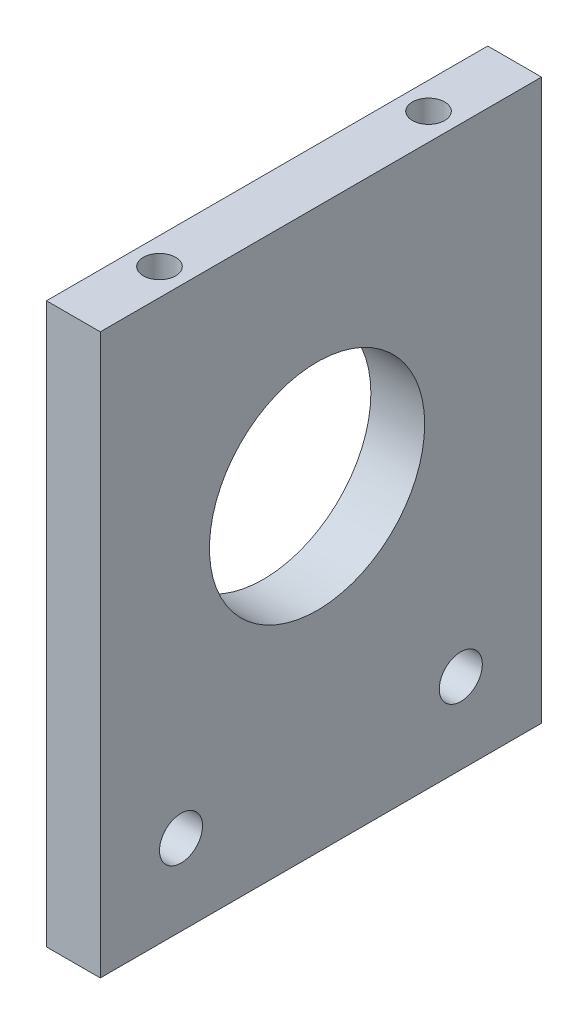
ISO-10303-21;
HEADER;
FILE_DESCRIPTION(('STEP AP214'),'2;1');
FILE_NAME('part.step','',(''),(''),'','','');
FILE_SCHEMA(('AUTOMOTIVE_DESIGN { 1 0 10303 214 1 1 1 1 }'));
ENDSEC;
DATA;
#1=APPLICATION_CONTEXT('core data for automotive mechanical design processes');
#2=APPLICATION_PROTOCOL_DEFINITION('international standard','automotive_design',2000,#1);
#3=PRODUCT_CONTEXT('',#1,'mechanical');
#4=PRODUCT('Part','Part','',(#3));
#5=PRODUCT_RELATED_PRODUCT_CATEGORY('part','',(#4));
#6=PRODUCT_DEFINITION_FORMATION('','',#4);
#7=PRODUCT_DEFINITION_CONTEXT('part definition',#1,'design');
#8=PRODUCT_DEFINITION('design','',#6,#7);
#9=PRODUCT_DEFINITION_SHAPE('','',#8);
#10=(LENGTH_UNIT() NAMED_UNIT(*) SI_UNIT(.MILLI.,.METRE.));
#11=(NAMED_UNIT(*) PLANE_ANGLE_UNIT() SI_UNIT($,.RADIAN.));
#12=(NAMED_UNIT(*) SI_UNIT($,.STERADIAN.) SOLID_ANGLE_UNIT());
#13=UNCERTAINTY_MEASURE_WITH_UNIT(LENGTH_MEASURE(1.E-05),#10,'distance_accuracy_value','');
#14=(GEOMETRIC_REPRESENTATION_CONTEXT(3) GLOBAL_UNCERTAINTY_ASSIGNED_CONTEXT((#13)) GLOBAL_UNIT_ASSIGNED_CONTEXT((#10,
#11,#12)) REPRESENTATION_CONTEXT('',''));
#15=CARTESIAN_POINT('',(0.,0.,0.));
#16=DIRECTION('',(0.,0.,1.));
#17=DIRECTION('',(1.,0.,0.));
#18=AXIS2_PLACEMENT_3D('',#15,#16,#17);
#19=CARTESIAN_POINT('',(5.,0.,0.));
#20=DIRECTION('',(-1.,0.,0.));
#21=DIRECTION('',(0.,0.,1.));
#22=AXIS2_PLACEMENT_3D('',#19,#20,#21);
#23=PLANE('',#22);
#24=CARTESIAN_POINT('',(5.,7.5,-33.5));
#25=DIRECTION('',(1.,0.,0.));
#26=DIRECTION('',(0.,0.,-1.));
#27=AXIS2_PLACEMENT_3D('',#24,#25,#26);
#28=CIRCLE('',#27,2.);
#29=CARTESIAN_POINT('',(5.,7.5,-35.5));
#30=VERTEX_POINT('',#29);
#31=EDGE_CURVE('E115',#30,#30,#28,.T.);
#32=ORIENTED_EDGE('',*,*,#31,.F.);
#33=EDGE_LOOP('',(#32));
#34=FACE_BOUND('',#33,.T.);
#35=DIRECTION('',(0.,-1.,0.));
#36=VECTOR('',#35,1.);
#37=CARTESIAN_POINT('',(5.,0.,0.));
#38=LINE('',#37,#36);
#39=CARTESIAN_POINT('',(5.,52.,0.));
#40=VERTEX_POINT('',#39);
#41=CARTESIAN_POINT('',(5.,0.,0.));
#42=VERTEX_POINT('',#41);
#43=EDGE_CURVE('E85',#40,#42,#38,.T.);
#44=ORIENTED_EDGE('',*,*,#43,.T.);
#45=DIRECTION('',(0.,0.,-1.));
#46=VECTOR('',#45,1.);
#47=CARTESIAN_POINT('',(5.,0.,0.));
#48=LINE('',#47,#46);
#49=CARTESIAN_POINT('',(5.,0.,-41.));
#50=VERTEX_POINT('',#49);
#51=EDGE_CURVE('E80',#42,#50,#48,.T.);
#52=ORIENTED_EDGE('',*,*,#51,.T.);
#53=DIRECTION('',(0.,1.,0.));
#54=VECTOR('',#53,1.);
#55=CARTESIAN_POINT('',(5.,0.,-41.));
#56=LINE('',#55,#54);
#57=CARTESIAN_POINT('',(5.,52.,-41.));
#58=VERTEX_POINT('',#57);
#59=EDGE_CURVE('E83',#50,#58,#56,.T.);
#60=ORIENTED_EDGE('',*,*,#59,.T.);
#61=DIRECTION('',(0.,0.,1.));
#62=VECTOR('',#61,1.);
#63=CARTESIAN_POINT('',(5.,52.,0.));
#64=LINE('',#63,#62);
#65=EDGE_CURVE('E50',#58,#40,#64,.T.);
#66=ORIENTED_EDGE('',*,*,#65,.T.);
#67=EDGE_LOOP('',(#44,#52,#60,#66));
#68=FACE_BOUND('',#67,.T.);
#69=CARTESIAN_POINT('',(5.,7.5,-7.5));
#70=DIRECTION('',(1.,0.,0.));
#71=DIRECTION('',(0.,0.,-1.));
#72=AXIS2_PLACEMENT_3D('',#69,#70,#71);
#73=CIRCLE('',#72,2.);
#74=CARTESIAN_POINT('',(5.,7.5,-9.5));
#75=VERTEX_POINT('',#74);
#76=EDGE_CURVE('E100',#75,#75,#73,.T.);
#77=ORIENTED_EDGE('',*,*,#76,.F.);
#78=EDGE_LOOP('',(#77));
#79=FACE_BOUND('',#78,.T.);
#80=CARTESIAN_POINT('',(5.,29.5,-20.1430247661483));
#81=DIRECTION('',(1.,0.,0.));
#82=DIRECTION('',(0.,0.,-1.));
#83=AXIS2_PLACEMENT_3D('',#80,#81,#82);
#84=CIRCLE('',#83,10.);
#85=CARTESIAN_POINT('',(5.,29.5,-30.1430247661483));
#86=VERTEX_POINT('',#85);
#87=EDGE_CURVE('E121',#86,#86,#84,.T.);
#88=ORIENTED_EDGE('',*,*,#87,.F.);
#89=EDGE_LOOP('',(#88));
#90=FACE_BOUND('',#89,.T.);
#91=ADVANCED_FACE('F33',(#34,#68,#79,#90),#23,.F.);
#92=CARTESIAN_POINT('',(0.,0.,0.));
#93=DIRECTION('',(-1.,0.,0.));
#94=DIRECTION('',(0.,0.,1.));
#95=AXIS2_PLACEMENT_3D('',#92,#93,#94);
#96=PLANE('',#95);
#97=CARTESIAN_POINT('',(0.,7.5,-33.5));
#98=DIRECTION('',(1.,0.,0.));
#99=DIRECTION('',(0.,0.,-1.));
#100=AXIS2_PLACEMENT_3D('',#97,#98,#99);
#101=CIRCLE('',#100,2.);
#102=CARTESIAN_POINT('',(0.,7.5,-35.5));
#103=VERTEX_POINT('',#102);
#104=EDGE_CURVE('E118',#103,#103,#101,.T.);
#105=ORIENTED_EDGE('',*,*,#104,.T.);
#106=EDGE_LOOP('',(#105));
#107=FACE_BOUND('',#106,.T.);
#108=DIRECTION('',(0.,-1.,0.));
#109=VECTOR('',#108,1.);
#110=CARTESIAN_POINT('',(0.,0.,0.));
#111=LINE('',#110,#109);
#112=CARTESIAN_POINT('',(0.,52.,0.));
#113=VERTEX_POINT('',#112);
#114=CARTESIAN_POINT('',(0.,0.,0.));
#115=VERTEX_POINT('',#114);
#116=EDGE_CURVE('E97',#113,#115,#111,.T.);
#117=ORIENTED_EDGE('',*,*,#116,.F.);
#118=DIRECTION('',(0.,0.,1.));
#119=VECTOR('',#118,1.);
#120=CARTESIAN_POINT('',(0.,52.,0.));
#121=LINE('',#120,#119);
#122=CARTESIAN_POINT('',(0.,52.,-41.));
#123=VERTEX_POINT('',#122);
#124=EDGE_CURVE('E73',#123,#113,#121,.T.);
#125=ORIENTED_EDGE('',*,*,#124,.F.);
#126=DIRECTION('',(0.,1.,0.));
#127=VECTOR('',#126,1.);
#128=CARTESIAN_POINT('',(0.,0.,-41.));
#129=LINE('',#128,#127);
#130=CARTESIAN_POINT('',(0.,0.,-41.));
#131=VERTEX_POINT('',#130);
#132=EDGE_CURVE('E67',#131,#123,#129,.T.);
#133=ORIENTED_EDGE('',*,*,#132,.F.);
#134=DIRECTION('',(0.,0.,-1.));
#135=VECTOR('',#134,1.);
#136=CARTESIAN_POINT('',(0.,0.,0.));
#137=LINE('',#136,#135);
#138=EDGE_CURVE('E89',#115,#131,#137,.T.);
#139=ORIENTED_EDGE('',*,*,#138,.F.);
#140=EDGE_LOOP('',(#117,#125,#133,#139));
#141=FACE_BOUND('',#140,.T.);
#142=CARTESIAN_POINT('',(0.,7.5,-7.5));
#143=DIRECTION('',(1.,0.,0.));
#144=DIRECTION('',(0.,0.,-1.));
#145=AXIS2_PLACEMENT_3D('',#142,#143,#144);
#146=CIRCLE('',#145,2.);
#147=CARTESIAN_POINT('',(0.,7.5,-9.5));
#148=VERTEX_POINT('',#147);
#149=EDGE_CURVE('E112',#148,#148,#146,.T.);
#150=ORIENTED_EDGE('',*,*,#149,.T.);
#151=EDGE_LOOP('',(#150));
#152=FACE_BOUND('',#151,.T.);
#153=CARTESIAN_POINT('',(0.,29.5,-20.1430247661483));
#154=DIRECTION('',(1.,0.,0.));
#155=DIRECTION('',(0.,0.,-1.));
#156=AXIS2_PLACEMENT_3D('',#153,#154,#155);
#157=CIRCLE('',#156,10.);
#158=CARTESIAN_POINT('',(0.,29.5,-30.1430247661483));
#159=VERTEX_POINT('',#158);
#160=EDGE_CURVE('E124',#159,#159,#157,.T.);
#161=ORIENTED_EDGE('',*,*,#160,.T.);
#162=EDGE_LOOP('',(#161));
#163=FACE_BOUND('',#162,.T.);
#164=ADVANCED_FACE('F108',(#107,#141,#152,#163),#96,.T.);
#165=CARTESIAN_POINT('',(5.,0.,0.));
#166=DIRECTION('',(0.,0.,-1.));
#167=DIRECTION('',(-1.,0.,0.));
#168=AXIS2_PLACEMENT_3D('',#165,#166,#167);
#169=PLANE('',#168);
#170=ORIENTED_EDGE('',*,*,#116,.T.);
#171=DIRECTION('',(-1.,0.,0.));
#172=VECTOR('',#171,1.);
#173=CARTESIAN_POINT('',(5.,0.,0.));
#174=LINE('',#173,#172);
#175=EDGE_CURVE('E11',#42,#115,#174,.T.);
#176=ORIENTED_EDGE('',*,*,#175,.F.);
#177=ORIENTED_EDGE('',*,*,#43,.F.);
#178=DIRECTION('',(-1.,0.,0.));
#179=VECTOR('',#178,1.);
#180=CARTESIAN_POINT('',(5.,52.,0.));
#181=LINE('',#180,#179);
#182=EDGE_CURVE('E93',#40,#113,#181,.T.);
#183=ORIENTED_EDGE('',*,*,#182,.T.);
#184=EDGE_LOOP('',(#170,#176,#177,#183));
#185=FACE_BOUND('',#184,.T.);
#186=ADVANCED_FACE('F35',(#185),#169,.F.);
#187=CARTESIAN_POINT('',(5.,0.,0.));
#188=DIRECTION('',(0.,1.,0.));
#189=DIRECTION('',(0.,0.,1.));
#190=AXIS2_PLACEMENT_3D('',#187,#188,#189);
#191=PLANE('',#190);
#192=CARTESIAN_POINT('',(2.5,0.,-28.));
#193=DIRECTION('',(0.,-1.,0.));
#194=DIRECTION('',(0.,0.,-1.));
#195=AXIS2_PLACEMENT_3D('',#192,#193,#194);
#196=CIRCLE('',#195,1.5);
#197=CARTESIAN_POINT('',(2.5,0.,-29.5));
#198=VERTEX_POINT('',#197);
#199=EDGE_CURVE('E136',#198,#198,#196,.T.);
#200=ORIENTED_EDGE('',*,*,#199,.F.);
#201=EDGE_LOOP('',(#200));
#202=FACE_BOUND('',#201,.T.);
#203=CARTESIAN_POINT('',(2.5,0.,-13.));
#204=DIRECTION('',(0.,-1.,0.));
#205=DIRECTION('',(0.,0.,-1.));
#206=AXIS2_PLACEMENT_3D('',#203,#204,#205);
#207=CIRCLE('',#206,1.5);
#208=CARTESIAN_POINT('',(2.5,0.,-14.5));
#209=VERTEX_POINT('',#208);
#210=EDGE_CURVE('E130',#209,#209,#207,.T.);
#211=ORIENTED_EDGE('',*,*,#210,.F.);
#212=EDGE_LOOP('',(#211));
#213=FACE_BOUND('',#212,.T.);
#214=ORIENTED_EDGE('',*,*,#138,.T.);
#215=DIRECTION('',(-1.,0.,0.));
#216=VECTOR('',#215,1.);
#217=CARTESIAN_POINT('',(5.,0.,-41.));
#218=LINE('',#217,#216);
#219=EDGE_CURVE('E42',#50,#131,#218,.T.);
#220=ORIENTED_EDGE('',*,*,#219,.F.);
#221=ORIENTED_EDGE('',*,*,#51,.F.);
#222=ORIENTED_EDGE('',*,*,#175,.T.);
#223=EDGE_LOOP('',(#214,#220,#221,#222));
#224=FACE_BOUND('',#223,.T.);
#225=ADVANCED_FACE('F88',(#202,#213,#224),#191,.F.);
#226=CARTESIAN_POINT('',(5.,0.,-41.));
#227=DIRECTION('',(0.,0.,1.));
#228=DIRECTION('',(1.,0.,0.));
#229=AXIS2_PLACEMENT_3D('',#226,#227,#228);
#230=PLANE('',#229);
#231=ORIENTED_EDGE('',*,*,#132,.T.);
#232=DIRECTION('',(-1.,0.,0.));
#233=VECTOR('',#232,1.);
#234=CARTESIAN_POINT('',(5.,52.,-41.));
#235=LINE('',#234,#233);
#236=EDGE_CURVE('E90',#58,#123,#235,.T.);
#237=ORIENTED_EDGE('',*,*,#236,.F.);
#238=ORIENTED_EDGE('',*,*,#59,.F.);
#239=ORIENTED_EDGE('',*,*,#219,.T.);
#240=EDGE_LOOP('',(#231,#237,#238,#239));
#241=FACE_BOUND('',#240,.T.);
#242=ADVANCED_FACE('F91',(#241),#230,.F.);
#243=CARTESIAN_POINT('',(5.,52.,0.));
#244=DIRECTION('',(0.,-1.,0.));
#245=DIRECTION('',(0.,0.,-1.));
#246=AXIS2_PLACEMENT_3D('',#243,#244,#245);
#247=PLANE('',#246);
#248=CARTESIAN_POINT('',(2.5,52.,-33.));
#249=DIRECTION('',(0.,1.,0.));
#250=DIRECTION('',(0.,0.,1.));
#251=AXIS2_PLACEMENT_3D('',#248,#249,#250);
#252=CIRCLE('',#251,1.5);
#253=CARTESIAN_POINT('',(2.5,52.,-31.5));
#254=VERTEX_POINT('',#253);
#255=EDGE_CURVE('E148',#254,#254,#252,.T.);
#256=ORIENTED_EDGE('',*,*,#255,.F.);
#257=EDGE_LOOP('',(#256));
#258=FACE_BOUND('',#257,.T.);
#259=CARTESIAN_POINT('',(2.5,52.,-8.));
#260=DIRECTION('',(0.,1.,0.));
#261=DIRECTION('',(0.,0.,1.));
#262=AXIS2_PLACEMENT_3D('',#259,#260,#261);
#263=CIRCLE('',#262,1.5);
#264=CARTESIAN_POINT('',(2.5,52.,-6.5));
#265=VERTEX_POINT('',#264);
#266=EDGE_CURVE('E142',#265,#265,#263,.T.);
#267=ORIENTED_EDGE('',*,*,#266,.F.);
#268=EDGE_LOOP('',(#267));
#269=FACE_BOUND('',#268,.T.);
#270=ORIENTED_EDGE('',*,*,#124,.T.);
#271=ORIENTED_EDGE('',*,*,#182,.F.);
#272=ORIENTED_EDGE('',*,*,#65,.F.);
#273=ORIENTED_EDGE('',*,*,#236,.T.);
#274=EDGE_LOOP('',(#270,#271,#272,#273));
#275=FACE_BOUND('',#274,.T.);
#276=ADVANCED_FACE('F105',(#258,#269,#275),#247,.F.);
#277=CARTESIAN_POINT('',(5.,7.5,-7.5));
#278=DIRECTION('',(-1.,0.,0.));
#279=DIRECTION('',(0.,0.,1.));
#280=AXIS2_PLACEMENT_3D('',#277,#278,#279);
#281=CYLINDRICAL_SURFACE('',#280,2.);
#282=ORIENTED_EDGE('',*,*,#76,.T.);
#283=EDGE_LOOP('',(#282));
#284=FACE_BOUND('',#283,.T.);
#285=ORIENTED_EDGE('',*,*,#149,.F.);
#286=EDGE_LOOP('',(#285));
#287=FACE_BOUND('',#286,.T.);
#288=ADVANCED_FACE('F165',(#284,#287),#281,.F.);
#289=CARTESIAN_POINT('',(5.,7.5,-33.5));
#290=DIRECTION('',(-1.,0.,0.));
#291=DIRECTION('',(0.,0.,1.));
#292=AXIS2_PLACEMENT_3D('',#289,#290,#291);
#293=CYLINDRICAL_SURFACE('',#292,2.);
#294=ORIENTED_EDGE('',*,*,#31,.T.);
#295=EDGE_LOOP('',(#294));
#296=FACE_BOUND('',#295,.T.);
#297=ORIENTED_EDGE('',*,*,#104,.F.);
#298=EDGE_LOOP('',(#297));
#299=FACE_BOUND('',#298,.T.);
#300=ADVANCED_FACE('F218',(#296,#299),#293,.F.);
#301=CARTESIAN_POINT('',(5.,29.5,-20.1430247661483));
#302=DIRECTION('',(-1.,0.,0.));
#303=DIRECTION('',(0.,0.,1.));
#304=AXIS2_PLACEMENT_3D('',#301,#302,#303);
#305=CYLINDRICAL_SURFACE('',#304,10.);
#306=ORIENTED_EDGE('',*,*,#87,.T.);
#307=EDGE_LOOP('',(#306));
#308=FACE_BOUND('',#307,.T.);
#309=ORIENTED_EDGE('',*,*,#160,.F.);
#310=EDGE_LOOP('',(#309));
#311=FACE_BOUND('',#310,.T.);
#312=ADVANCED_FACE('F209',(#308,#311),#305,.F.);
#313=CARTESIAN_POINT('',(2.5,7.,-13.));
#314=DIRECTION('',(0.,-1.,0.));
#315=DIRECTION('',(0.,0.,-1.));
#316=AXIS2_PLACEMENT_3D('',#313,#314,#315);
#317=CYLINDRICAL_SURFACE('',#316,1.5);
#318=CARTESIAN_POINT('',(2.5,7.,-13.));
#319=DIRECTION('',(0.,-1.,0.));
#320=DIRECTION('',(0.,0.,-1.));
#321=AXIS2_PLACEMENT_3D('',#318,#319,#320);
#322=CIRCLE('',#321,1.5);
#323=CARTESIAN_POINT('',(2.5,7.,-14.5));
#324=VERTEX_POINT('',#323);
#325=EDGE_CURVE('E127',#324,#324,#322,.T.);
#326=ORIENTED_EDGE('',*,*,#325,.F.);
#327=EDGE_LOOP('',(#326));
#328=FACE_BOUND('',#327,.T.);
#329=ORIENTED_EDGE('',*,*,#210,.T.);
#330=EDGE_LOOP('',(#329));
#331=FACE_BOUND('',#330,.T.);
#332=ADVANCED_FACE('F206',(#328,#331),#317,.F.);
#333=CARTESIAN_POINT('',(2.5,7.,-13.));
#334=DIRECTION('',(0.,-1.,0.));
#335=DIRECTION('',(0.,0.,-1.));
#336=AXIS2_PLACEMENT_3D('',#333,#334,#335);
#337=PLANE('',#336);
#338=ORIENTED_EDGE('',*,*,#325,.T.);
#339=EDGE_LOOP('',(#338));
#340=FACE_BOUND('',#339,.T.);
#341=ADVANCED_FACE('F208',(#340),#337,.T.);
#342=CARTESIAN_POINT('',(2.5,7.,-28.));
#343=DIRECTION('',(0.,-1.,0.));
#344=DIRECTION('',(0.,0.,-1.));
#345=AXIS2_PLACEMENT_3D('',#342,#343,#344);
#346=CYLINDRICAL_SURFACE('',#345,1.5);
#347=CARTESIAN_POINT('',(2.5,7.,-28.));
#348=DIRECTION('',(0.,-1.,0.));
#349=DIRECTION('',(0.,0.,-1.));
#350=AXIS2_PLACEMENT_3D('',#347,#348,#349);
#351=CIRCLE('',#350,1.5);
#352=CARTESIAN_POINT('',(2.5,7.,-29.5));
#353=VERTEX_POINT('',#352);
#354=EDGE_CURVE('E133',#353,#353,#351,.T.);
#355=ORIENTED_EDGE('',*,*,#354,.F.);
#356=EDGE_LOOP('',(#355));
#357=FACE_BOUND('',#356,.T.);
#358=ORIENTED_EDGE('',*,*,#199,.T.);
#359=EDGE_LOOP('',(#358));
#360=FACE_BOUND('',#359,.T.);
#361=ADVANCED_FACE('F180',(#357,#360),#346,.F.);
#362=CARTESIAN_POINT('',(2.5,7.,-28.));
#363=DIRECTION('',(0.,-1.,0.));
#364=DIRECTION('',(0.,0.,-1.));
#365=AXIS2_PLACEMENT_3D('',#362,#363,#364);
#366=PLANE('',#365);
#367=ORIENTED_EDGE('',*,*,#354,.T.);
#368=EDGE_LOOP('',(#367));
#369=FACE_BOUND('',#368,.T.);
#370=ADVANCED_FACE('F171',(#369),#366,.T.);
#371=CARTESIAN_POINT('',(2.5,45.,-8.));
#372=DIRECTION('',(0.,1.,0.));
#373=DIRECTION('',(0.,0.,1.));
#374=AXIS2_PLACEMENT_3D('',#371,#372,#373);
#375=CYLINDRICAL_SURFACE('',#374,1.5);
#376=CARTESIAN_POINT('',(2.5,45.,-8.));
#377=DIRECTION('',(0.,1.,0.));
#378=DIRECTION('',(0.,0.,1.));
#379=AXIS2_PLACEMENT_3D('',#376,#377,#378);
#380=CIRCLE('',#379,1.5);
#381=CARTESIAN_POINT('',(2.5,45.,-6.5));
#382=VERTEX_POINT('',#381);
#383=EDGE_CURVE('E139',#382,#382,#380,.T.);
#384=ORIENTED_EDGE('',*,*,#383,.F.);
#385=EDGE_LOOP('',(#384));
#386=FACE_BOUND('',#385,.T.);
#387=ORIENTED_EDGE('',*,*,#266,.T.);
#388=EDGE_LOOP('',(#387));
#389=FACE_BOUND('',#388,.T.);
#390=ADVANCED_FACE('F169',(#386,#389),#375,.F.);
#391=CARTESIAN_POINT('',(2.5,45.,-8.));
#392=DIRECTION('',(0.,1.,0.));
#393=DIRECTION('',(0.,0.,1.));
#394=AXIS2_PLACEMENT_3D('',#391,#392,#393);
#395=PLANE('',#394);
#396=ORIENTED_EDGE('',*,*,#383,.T.);
#397=EDGE_LOOP('',(#396));
#398=FACE_BOUND('',#397,.T.);
#399=ADVANCED_FACE('F159',(#398),#395,.T.);
#400=CARTESIAN_POINT('',(2.5,45.,-33.));
#401=DIRECTION('',(0.,1.,0.));
#402=DIRECTION('',(0.,0.,1.));
#403=AXIS2_PLACEMENT_3D('',#400,#401,#402);
#404=CYLINDRICAL_SURFACE('',#403,1.5);
#405=CARTESIAN_POINT('',(2.5,45.,-33.));
#406=DIRECTION('',(0.,1.,0.));
#407=DIRECTION('',(0.,0.,1.));
#408=AXIS2_PLACEMENT_3D('',#405,#406,#407);
#409=CIRCLE('',#408,1.5);
#410=CARTESIAN_POINT('',(2.5,45.,-31.5));
#411=VERTEX_POINT('',#410);
#412=EDGE_CURVE('E145',#411,#411,#409,.T.);
#413=ORIENTED_EDGE('',*,*,#412,.F.);
#414=EDGE_LOOP('',(#413));
#415=FACE_BOUND('',#414,.T.);
#416=ORIENTED_EDGE('',*,*,#255,.T.);
#417=EDGE_LOOP('',(#416));
#418=FACE_BOUND('',#417,.T.);
#419=ADVANCED_FACE('F156',(#415,#418),#404,.F.);
#420=CARTESIAN_POINT('',(2.5,45.,-33.));
#421=DIRECTION('',(0.,1.,0.));
#422=DIRECTION('',(0.,0.,1.));
#423=AXIS2_PLACEMENT_3D('',#420,#421,#422);
#424=PLANE('',#423);
#425=ORIENTED_EDGE('',*,*,#412,.T.);
#426=EDGE_LOOP('',(#425));
#427=FACE_BOUND('',#426,.T.);
#428=ADVANCED_FACE('F154',(#427),#424,.T.);
#429=CLOSED_SHELL('',(#91,#164,#186,#225,#242,#276,#288,#300,#312,#332,#341,#361,#370,#390,#399,
#419,#428));
#430=MANIFOLD_SOLID_BREP('B2',#429);
#431=ADVANCED_BREP_SHAPE_REPRESENTATION('',(#18,#430),#14);
#432=SHAPE_DEFINITION_REPRESENTATION(#9,#431);
ENDSEC;
END-ISO-10303-21;
